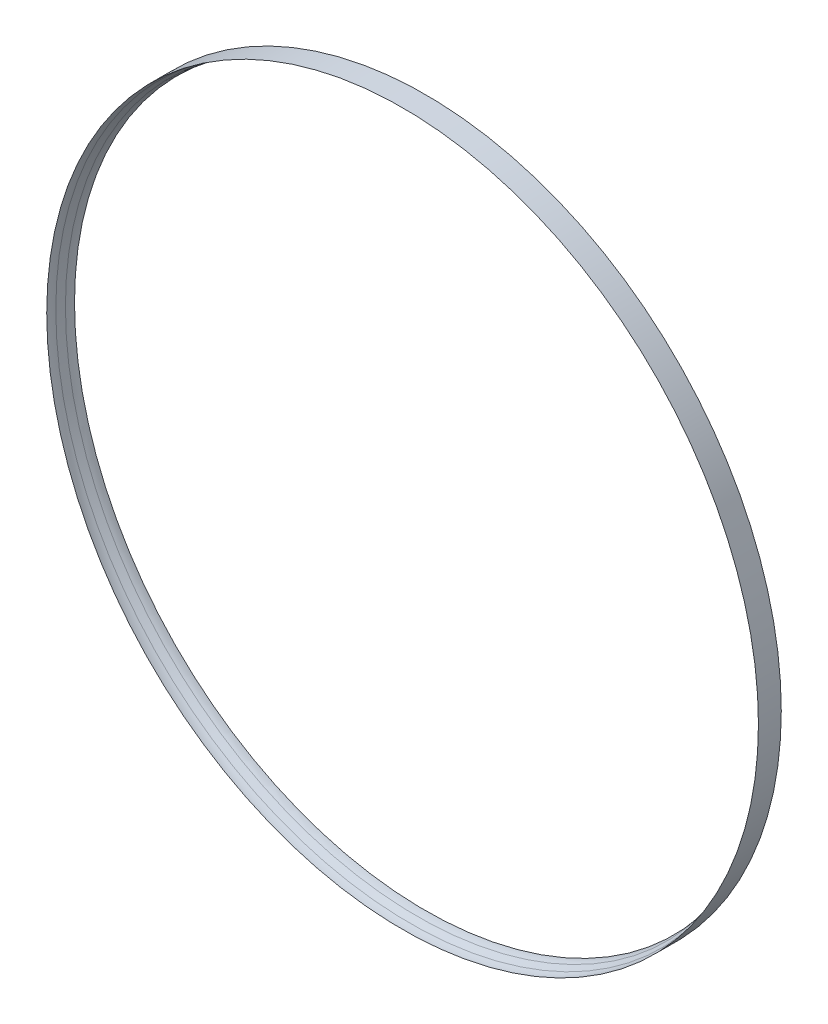
ISO-10303-21;
HEADER;
FILE_DESCRIPTION(('STEP AP214'),'2;1');
FILE_NAME('part.step','',(''),(''),'','','');
FILE_SCHEMA(('AUTOMOTIVE_DESIGN { 1 0 10303 214 1 1 1 1 }'));
ENDSEC;
DATA;
#1=APPLICATION_CONTEXT('core data for automotive mechanical design processes');
#2=APPLICATION_PROTOCOL_DEFINITION('international standard','automotive_design',2000,#1);
#3=PRODUCT_CONTEXT('',#1,'mechanical');
#4=PRODUCT('Part','Part','',(#3));
#5=PRODUCT_RELATED_PRODUCT_CATEGORY('part','',(#4));
#6=PRODUCT_DEFINITION_FORMATION('','',#4);
#7=PRODUCT_DEFINITION_CONTEXT('part definition',#1,'design');
#8=PRODUCT_DEFINITION('design','',#6,#7);
#9=PRODUCT_DEFINITION_SHAPE('','',#8);
#10=(LENGTH_UNIT() NAMED_UNIT(*) SI_UNIT(.MILLI.,.METRE.));
#11=(NAMED_UNIT(*) PLANE_ANGLE_UNIT() SI_UNIT($,.RADIAN.));
#12=(NAMED_UNIT(*) SI_UNIT($,.STERADIAN.) SOLID_ANGLE_UNIT());
#13=UNCERTAINTY_MEASURE_WITH_UNIT(LENGTH_MEASURE(1.E-05),#10,'distance_accuracy_value','');
#14=(GEOMETRIC_REPRESENTATION_CONTEXT(3) GLOBAL_UNCERTAINTY_ASSIGNED_CONTEXT((#13)) GLOBAL_UNIT_ASSIGNED_CONTEXT((#10,
#11,#12)) REPRESENTATION_CONTEXT('',''));
#15=CARTESIAN_POINT('',(0.,0.,0.));
#16=DIRECTION('',(0.,0.,1.));
#17=DIRECTION('',(1.,0.,0.));
#18=AXIS2_PLACEMENT_3D('',#15,#16,#17);
#19=CARTESIAN_POINT('',(0.,0.,0.));
#20=DIRECTION('',(0.,0.,1.));
#21=DIRECTION('',(1.,0.,0.));
#22=AXIS2_PLACEMENT_3D('',#19,#20,#21);
#23=PLANE('',#22);
#24=CARTESIAN_POINT('',(0.,0.,0.));
#25=DIRECTION('',(0.,0.,1.));
#26=DIRECTION('',(1.,0.,0.));
#27=AXIS2_PLACEMENT_3D('',#24,#25,#26);
#28=CIRCLE('',#27,72.0000000000001);
#29=CARTESIAN_POINT('',(72.0000000000001,0.,0.));
#30=VERTEX_POINT('',#29);
#31=EDGE_CURVE('E11',#30,#30,#28,.T.);
#32=ORIENTED_EDGE('',*,*,#31,.F.);
#33=EDGE_LOOP('',(#32));
#34=FACE_BOUND('',#33,.T.);
#35=CARTESIAN_POINT('',(0.,0.,0.));
#36=DIRECTION('',(0.,0.,-1.));
#37=DIRECTION('',(-1.,0.,0.));
#38=AXIS2_PLACEMENT_3D('',#35,#36,#37);
#39=CIRCLE('',#38,71.);
#40=CARTESIAN_POINT('',(-71.,0.,0.));
#41=VERTEX_POINT('',#40);
#42=EDGE_CURVE('E50',#41,#41,#39,.T.);
#43=ORIENTED_EDGE('',*,*,#42,.F.);
#44=EDGE_LOOP('',(#43));
#45=FACE_BOUND('',#44,.T.);
#46=ADVANCED_FACE('F32',(#34,#45),#23,.F.);
#47=CARTESIAN_POINT('',(0.,0.,100.40916292849));
#48=DIRECTION('',(0.,0.,-1.));
#49=DIRECTION('',(-1.,0.,0.));
#50=AXIS2_PLACEMENT_3D('',#47,#48,#49);
#51=CYLINDRICAL_SURFACE('',#50,72.0000000000001);
#52=CARTESIAN_POINT('',(0.,0.,4.62277660168383));
#53=DIRECTION('',(0.,0.,-1.));
#54=DIRECTION('',(-1.,0.,0.));
#55=AXIS2_PLACEMENT_3D('',#52,#53,#54);
#56=CIRCLE('',#55,72.0000000000001);
#57=CARTESIAN_POINT('',(-72.0000000000001,0.,4.62277660168383));
#58=VERTEX_POINT('',#57);
#59=EDGE_CURVE('E36',#58,#58,#56,.T.);
#60=ORIENTED_EDGE('',*,*,#59,.T.);
#61=EDGE_LOOP('',(#60));
#62=FACE_BOUND('',#61,.T.);
#63=ORIENTED_EDGE('',*,*,#31,.T.);
#64=EDGE_LOOP('',(#63));
#65=FACE_BOUND('',#64,.T.);
#66=ADVANCED_FACE('F58',(#62,#65),#51,.T.);
#67=CARTESIAN_POINT('',(0.,0.,4.62277660168383));
#68=DIRECTION('',(0.,0.,-1.));
#69=DIRECTION('',(-1.,0.,0.));
#70=AXIS2_PLACEMENT_3D('',#67,#68,#69);
#71=TOROIDAL_SURFACE('',#70,67.,5.00000000000002);
#72=CARTESIAN_POINT('',(0.,0.,3.04163777159962));
#73=DIRECTION('',(0.,0.,-1.));
#74=DIRECTION('',(-1.,0.,0.));
#75=AXIS2_PLACEMENT_3D('',#72,#73,#74);
#76=CIRCLE('',#75,71.7434164902526);
#77=CARTESIAN_POINT('',(-71.7434164902526,0.,3.04163777159962));
#78=VERTEX_POINT('',#77);
#79=EDGE_CURVE('E43',#78,#78,#76,.T.);
#80=ORIENTED_EDGE('',*,*,#79,.T.);
#81=EDGE_LOOP('',(#80));
#82=FACE_BOUND('',#81,.T.);
#83=ORIENTED_EDGE('',*,*,#59,.F.);
#84=EDGE_LOOP('',(#83));
#85=FACE_BOUND('',#84,.T.);
#86=ADVANCED_FACE('F34',(#82,#85),#71,.F.);
#87=CARTESIAN_POINT('',(0.,0.,3.04163777159962));
#88=DIRECTION('',(0.,0.,1.));
#89=DIRECTION('',(1.,0.,0.));
#90=AXIS2_PLACEMENT_3D('',#87,#88,#89);
#91=CONICAL_SURFACE('',#90,71.7434164902526,0.321750554396634);
#92=CARTESIAN_POINT('',(0.,0.,1.58113883008419));
#93=DIRECTION('',(0.,0.,-1.));
#94=DIRECTION('',(-1.,0.,0.));
#95=AXIS2_PLACEMENT_3D('',#92,#93,#94);
#96=CIRCLE('',#95,71.2565835097474);
#97=CARTESIAN_POINT('',(-71.2565835097474,0.,1.58113883008419));
#98=VERTEX_POINT('',#97);
#99=EDGE_CURVE('E47',#98,#98,#96,.T.);
#100=ORIENTED_EDGE('',*,*,#99,.T.);
#101=EDGE_LOOP('',(#100));
#102=FACE_BOUND('',#101,.T.);
#103=ORIENTED_EDGE('',*,*,#79,.F.);
#104=EDGE_LOOP('',(#103));
#105=FACE_BOUND('',#104,.T.);
#106=ADVANCED_FACE('F66',(#102,#105),#91,.F.);
#107=CARTESIAN_POINT('',(0.,0.,0.));
#108=DIRECTION('',(0.,0.,-1.));
#109=DIRECTION('',(-1.,0.,0.));
#110=AXIS2_PLACEMENT_3D('',#107,#108,#109);
#111=TOROIDAL_SURFACE('',#110,76.,5.);
#112=ORIENTED_EDGE('',*,*,#42,.T.);
#113=EDGE_LOOP('',(#112));
#114=FACE_BOUND('',#113,.T.);
#115=ORIENTED_EDGE('',*,*,#99,.F.);
#116=EDGE_LOOP('',(#115));
#117=FACE_BOUND('',#116,.T.);
#118=ADVANCED_FACE('F54',(#114,#117),#111,.T.);
#119=CLOSED_SHELL('',(#46,#66,#86,#106,#118));
#120=MANIFOLD_SOLID_BREP('B2',#119);
#121=ADVANCED_BREP_SHAPE_REPRESENTATION('',(#18,#120),#14);
#122=SHAPE_DEFINITION_REPRESENTATION(#9,#121);
ENDSEC;
END-ISO-10303-21;
